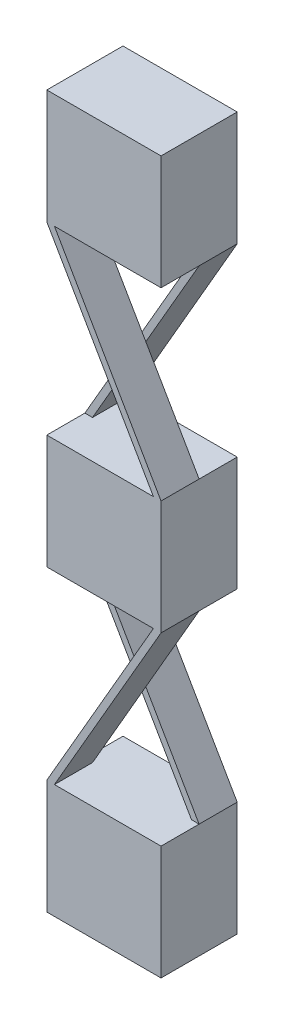
ISO-10303-21;
HEADER;
FILE_DESCRIPTION(('STEP AP214'),'2;1');
FILE_NAME('part.step','',(''),(''),'','','');
FILE_SCHEMA(('AUTOMOTIVE_DESIGN { 1 0 10303 214 1 1 1 1 }'));
ENDSEC;
DATA;
#1=APPLICATION_CONTEXT('core data for automotive mechanical design processes');
#2=APPLICATION_PROTOCOL_DEFINITION('international standard','automotive_design',2000,#1);
#3=PRODUCT_CONTEXT('',#1,'mechanical');
#4=PRODUCT('Part','Part','',(#3));
#5=PRODUCT_RELATED_PRODUCT_CATEGORY('part','',(#4));
#6=PRODUCT_DEFINITION_FORMATION('','',#4);
#7=PRODUCT_DEFINITION_CONTEXT('part definition',#1,'design');
#8=PRODUCT_DEFINITION('design','',#6,#7);
#9=PRODUCT_DEFINITION_SHAPE('','',#8);
#10=(LENGTH_UNIT() NAMED_UNIT(*) SI_UNIT(.MILLI.,.METRE.));
#11=(NAMED_UNIT(*) PLANE_ANGLE_UNIT() SI_UNIT($,.RADIAN.));
#12=(NAMED_UNIT(*) SI_UNIT($,.STERADIAN.) SOLID_ANGLE_UNIT());
#13=UNCERTAINTY_MEASURE_WITH_UNIT(LENGTH_MEASURE(1.E-05),#10,'distance_accuracy_value','');
#14=(GEOMETRIC_REPRESENTATION_CONTEXT(3) GLOBAL_UNCERTAINTY_ASSIGNED_CONTEXT((#13)) GLOBAL_UNIT_ASSIGNED_CONTEXT((#10,
#11,#12)) REPRESENTATION_CONTEXT('',''));
#15=CARTESIAN_POINT('',(0.,0.,0.));
#16=DIRECTION('',(0.,0.,1.));
#17=DIRECTION('',(1.,0.,0.));
#18=AXIS2_PLACEMENT_3D('',#15,#16,#17);
#19=CARTESIAN_POINT('',(0.,0.,0.));
#20=DIRECTION('',(0.,0.,1.));
#21=DIRECTION('',(1.,0.,0.));
#22=AXIS2_PLACEMENT_3D('',#19,#20,#21);
#23=PLANE('',#22);
#24=DIRECTION('',(0.500000000000005,-0.866025403784436,0.));
#25=VECTOR('',#24,1.);
#26=CARTESIAN_POINT('',(17.3701905283832,10.0286841774373,0.));
#27=LINE('',#26,#25);
#28=CARTESIAN_POINT('',(-6.50000000000005,51.3730669589459,0.));
#29=VERTEX_POINT('',#28);
#30=CARTESIAN_POINT('',(0.,40.1147367097484,0.));
#31=VERTEX_POINT('',#30);
#32=EDGE_CURVE('E283',#29,#31,#27,.T.);
#33=ORIENTED_EDGE('',*,*,#32,.T.);
#34=DIRECTION('',(-0.500000000000002,-0.866025403784437,0.));
#35=VECTOR('',#34,1.);
#36=CARTESIAN_POINT('',(-17.3701905283832,10.0286841774372,0.));
#37=LINE('',#36,#35);
#38=CARTESIAN_POINT('',(-0.500000000000046,39.248711305964,0.));
#39=VERTEX_POINT('',#38);
#40=EDGE_CURVE('E12',#31,#39,#37,.T.);
#41=ORIENTED_EDGE('',*,*,#40,.T.);
#42=DIRECTION('',(-0.500000000000007,0.866025403784435,0.));
#43=VECTOR('',#42,1.);
#44=CARTESIAN_POINT('',(16.6201905283833,9.59567147554515,0.));
#45=LINE('',#44,#43);
#46=CARTESIAN_POINT('',(-7.50000000000008,51.3730669589459,0.));
#47=VERTEX_POINT('',#46);
#48=EDGE_CURVE('E360',#39,#47,#45,.T.);
#49=ORIENTED_EDGE('',*,*,#48,.T.);
#50=DIRECTION('',(1.,0.,0.));
#51=VECTOR('',#50,1.);
#52=CARTESIAN_POINT('',(-1.30706495753698E-13,51.373066958946,0.));
#53=LINE('',#52,#51);
#54=EDGE_CURVE('E560',#47,#29,#53,.T.);
#55=ORIENTED_EDGE('',*,*,#54,.T.);
#56=EDGE_LOOP('',(#33,#41,#49,#55));
#57=FACE_BOUND('',#56,.T.);
#58=ADVANCED_FACE('F54',(#57),#23,.F.);
#59=CARTESIAN_POINT('',(0.,27.124355652982,5.));
#60=DIRECTION('',(0.,-1.,0.));
#61=DIRECTION('',(1.,0.,0.));
#62=AXIS2_PLACEMENT_3D('',#59,#60,#61);
#63=PLANE('',#62);
#64=DIRECTION('',(-1.,0.,0.));
#65=VECTOR('',#64,1.);
#66=CARTESIAN_POINT('',(0.,27.124355652982,-5.));
#67=LINE('',#66,#65);
#68=CARTESIAN_POINT('',(7.49999999999999,27.124355652982,-5.));
#69=VERTEX_POINT('',#68);
#70=CARTESIAN_POINT('',(-6.50000000000003,27.124355652982,-5.));
#71=VERTEX_POINT('',#70);
#72=EDGE_CURVE('E541',#69,#71,#67,.T.);
#73=ORIENTED_EDGE('',*,*,#72,.T.);
#74=DIRECTION('',(0.,0.,-1.));
#75=VECTOR('',#74,1.);
#76=CARTESIAN_POINT('',(-6.50000000000003,27.124355652982,0.));
#77=LINE('',#76,#75);
#78=CARTESIAN_POINT('',(-6.50000000000003,27.124355652982,0.));
#79=VERTEX_POINT('',#78);
#80=EDGE_CURVE('E577',#79,#71,#77,.T.);
#81=ORIENTED_EDGE('',*,*,#80,.F.);
#82=DIRECTION('',(-1.,0.,0.));
#83=VECTOR('',#82,1.);
#84=CARTESIAN_POINT('',(0.,27.124355652982,0.));
#85=LINE('',#84,#83);
#86=CARTESIAN_POINT('',(-7.50000000000002,27.124355652982,0.));
#87=VERTEX_POINT('',#86);
#88=EDGE_CURVE('E595',#79,#87,#85,.T.);
#89=ORIENTED_EDGE('',*,*,#88,.T.);
#90=DIRECTION('',(0.,0.,-1.));
#91=VECTOR('',#90,1.);
#92=CARTESIAN_POINT('',(-7.50000000000001,27.124355652982,5.));
#93=LINE('',#92,#91);
#94=CARTESIAN_POINT('',(-7.50000000000001,27.124355652982,5.));
#95=VERTEX_POINT('',#94);
#96=EDGE_CURVE('E367',#95,#87,#93,.T.);
#97=ORIENTED_EDGE('',*,*,#96,.F.);
#98=DIRECTION('',(-1.,0.,0.));
#99=VECTOR('',#98,1.);
#100=CARTESIAN_POINT('',(0.,27.124355652982,5.));
#101=LINE('',#100,#99);
#102=CARTESIAN_POINT('',(6.5,27.124355652982,5.));
#103=VERTEX_POINT('',#102);
#104=EDGE_CURVE('E551',#103,#95,#101,.T.);
#105=ORIENTED_EDGE('',*,*,#104,.F.);
#106=DIRECTION('',(0.,0.,1.));
#107=VECTOR('',#106,1.);
#108=CARTESIAN_POINT('',(6.5,27.124355652982,0.));
#109=LINE('',#108,#107);
#110=CARTESIAN_POINT('',(6.5,27.124355652982,0.));
#111=VERTEX_POINT('',#110);
#112=EDGE_CURVE('E271',#111,#103,#109,.T.);
#113=ORIENTED_EDGE('',*,*,#112,.F.);
#114=DIRECTION('',(1.,0.,0.));
#115=VECTOR('',#114,1.);
#116=CARTESIAN_POINT('',(0.,27.124355652982,0.));
#117=LINE('',#116,#115);
#118=CARTESIAN_POINT('',(7.49999999999999,27.124355652982,0.));
#119=VERTEX_POINT('',#118);
#120=EDGE_CURVE('E355',#111,#119,#117,.T.);
#121=ORIENTED_EDGE('',*,*,#120,.T.);
#122=DIRECTION('',(0.,0.,-1.));
#123=VECTOR('',#122,1.);
#124=CARTESIAN_POINT('',(7.49999999999999,27.124355652982,5.));
#125=LINE('',#124,#123);
#126=EDGE_CURVE('E352',#119,#69,#125,.T.);
#127=ORIENTED_EDGE('',*,*,#126,.T.);
#128=EDGE_LOOP('',(#73,#81,#89,#97,#105,#113,#121,#127));
#129=FACE_BOUND('',#128,.T.);
#130=ADVANCED_FACE('F357',(#129),#63,.F.);
#131=CARTESIAN_POINT('',(0.,-12.124355652982,5.));
#132=DIRECTION('',(0.,-1.,0.));
#133=DIRECTION('',(1.,0.,0.));
#134=AXIS2_PLACEMENT_3D('',#131,#132,#133);
#135=PLANE('',#134);
#136=DIRECTION('',(0.,0.,-1.));
#137=VECTOR('',#136,1.);
#138=CARTESIAN_POINT('',(6.49999999999997,-12.124355652982,0.));
#139=LINE('',#138,#137);
#140=CARTESIAN_POINT('',(6.49999999999997,-12.124355652982,0.));
#141=VERTEX_POINT('',#140);
#142=CARTESIAN_POINT('',(6.49999999999997,-12.124355652982,-5.));
#143=VERTEX_POINT('',#142);
#144=EDGE_CURVE('E407',#141,#143,#139,.T.);
#145=ORIENTED_EDGE('',*,*,#144,.T.);
#146=DIRECTION('',(-1.,0.,0.));
#147=VECTOR('',#146,1.);
#148=CARTESIAN_POINT('',(0.,-12.124355652982,-5.));
#149=LINE('',#148,#147);
#150=CARTESIAN_POINT('',(-7.5,-12.124355652982,-5.));
#151=VERTEX_POINT('',#150);
#152=EDGE_CURVE('E305',#143,#151,#149,.T.);
#153=ORIENTED_EDGE('',*,*,#152,.T.);
#154=DIRECTION('',(0.,0.,-1.));
#155=VECTOR('',#154,1.);
#156=CARTESIAN_POINT('',(-7.5,-12.124355652982,5.));
#157=LINE('',#156,#155);
#158=CARTESIAN_POINT('',(-7.5,-12.124355652982,0.));
#159=VERTEX_POINT('',#158);
#160=EDGE_CURVE('E314',#159,#151,#157,.T.);
#161=ORIENTED_EDGE('',*,*,#160,.F.);
#162=DIRECTION('',(1.,0.,0.));
#163=VECTOR('',#162,1.);
#164=CARTESIAN_POINT('',(0.,-12.124355652982,0.));
#165=LINE('',#164,#163);
#166=CARTESIAN_POINT('',(-6.49999999999997,-12.124355652982,0.));
#167=VERTEX_POINT('',#166);
#168=EDGE_CURVE('E422',#159,#167,#165,.T.);
#169=ORIENTED_EDGE('',*,*,#168,.T.);
#170=DIRECTION('',(0.,0.,1.));
#171=VECTOR('',#170,1.);
#172=CARTESIAN_POINT('',(-6.49999999999997,-12.124355652982,0.));
#173=LINE('',#172,#171);
#174=CARTESIAN_POINT('',(-6.49999999999997,-12.124355652982,5.));
#175=VERTEX_POINT('',#174);
#176=EDGE_CURVE('E443',#167,#175,#173,.T.);
#177=ORIENTED_EDGE('',*,*,#176,.T.);
#178=DIRECTION('',(-1.,0.,0.));
#179=VECTOR('',#178,1.);
#180=CARTESIAN_POINT('',(0.,-12.124355652982,5.));
#181=LINE('',#180,#179);
#182=CARTESIAN_POINT('',(7.49999999999997,-12.124355652982,5.));
#183=VERTEX_POINT('',#182);
#184=EDGE_CURVE('E459',#183,#175,#181,.T.);
#185=ORIENTED_EDGE('',*,*,#184,.F.);
#186=DIRECTION('',(0.,0.,-1.));
#187=VECTOR('',#186,1.);
#188=CARTESIAN_POINT('',(7.49999999999997,-12.124355652982,5.));
#189=LINE('',#188,#187);
#190=CARTESIAN_POINT('',(7.49999999999997,-12.124355652982,0.));
#191=VERTEX_POINT('',#190);
#192=EDGE_CURVE('E313',#183,#191,#189,.T.);
#193=ORIENTED_EDGE('',*,*,#192,.T.);
#194=DIRECTION('',(-1.,0.,0.));
#195=VECTOR('',#194,1.);
#196=CARTESIAN_POINT('',(0.,-12.124355652982,0.));
#197=LINE('',#196,#195);
#198=EDGE_CURVE('E378',#191,#141,#197,.T.);
#199=ORIENTED_EDGE('',*,*,#198,.T.);
#200=EDGE_LOOP('',(#145,#153,#161,#169,#177,#185,#193,#199));
#201=FACE_BOUND('',#200,.T.);
#202=ADVANCED_FACE('F492',(#201),#135,.F.);
#203=CARTESIAN_POINT('',(0.,0.,0.));
#204=DIRECTION('',(0.,0.,1.));
#205=DIRECTION('',(1.,0.,0.));
#206=AXIS2_PLACEMENT_3D('',#203,#204,#205);
#207=PLANE('',#206);
#208=DIRECTION('',(-0.500000000000004,0.866025403784436,0.));
#209=VECTOR('',#208,1.);
#210=CARTESIAN_POINT('',(-0.375000000000011,-0.216506350946119,0.));
#211=LINE('',#210,#209);
#212=CARTESIAN_POINT('',(0.,-0.866025403784445,0.));
#213=VERTEX_POINT('',#212);
#214=CARTESIAN_POINT('',(-0.500000000000004,0.,0.));
#215=VERTEX_POINT('',#214);
#216=EDGE_CURVE('E328',#213,#215,#211,.T.);
#217=ORIENTED_EDGE('',*,*,#216,.F.);
#218=DIRECTION('',(0.500000000000003,0.866025403784437,0.));
#219=VECTOR('',#218,1.);
#220=CARTESIAN_POINT('',(0.374999999999998,-0.21650635094611,0.));
#221=LINE('',#220,#219);
#222=EDGE_CURVE('E418',#167,#213,#221,.T.);
#223=ORIENTED_EDGE('',*,*,#222,.F.);
#224=ORIENTED_EDGE('',*,*,#168,.F.);
#225=DIRECTION('',(-0.500000000000005,-0.866025403784436,0.));
#226=VECTOR('',#225,1.);
#227=CARTESIAN_POINT('',(-0.374999999999991,0.216506350946107,0.));
#228=LINE('',#227,#226);
#229=EDGE_CURVE('E427',#215,#159,#228,.T.);
#230=ORIENTED_EDGE('',*,*,#229,.F.);
#231=EDGE_LOOP('',(#217,#223,#224,#230));
#232=FACE_BOUND('',#231,.T.);
#233=ADVANCED_FACE('F716',(#232),#207,.F.);
#234=DIRECTION('',(0.500000000000004,-0.866025403784436,0.));
#235=VECTOR('',#234,1.);
#236=CARTESIAN_POINT('',(0.374999999999982,0.216506350946102,0.));
#237=LINE('',#236,#235);
#238=CARTESIAN_POINT('',(0.,0.866025403784402,0.));
#239=VERTEX_POINT('',#238);
#240=CARTESIAN_POINT('',(0.499999999999989,0.,0.));
#241=VERTEX_POINT('',#240);
#242=EDGE_CURVE('E324',#239,#241,#237,.T.);
#243=ORIENTED_EDGE('',*,*,#242,.F.);
#244=CARTESIAN_POINT('',(6.50000000000002,12.124355652982,0.));
#245=VERTEX_POINT('',#244);
#246=EDGE_CURVE('E428',#245,#239,#228,.T.);
#247=ORIENTED_EDGE('',*,*,#246,.F.);
#248=DIRECTION('',(1.,0.,0.));
#249=VECTOR('',#248,1.);
#250=CARTESIAN_POINT('',(0.,12.124355652982,0.));
#251=LINE('',#250,#249);
#252=CARTESIAN_POINT('',(7.49999999999997,12.124355652982,0.));
#253=VERTEX_POINT('',#252);
#254=EDGE_CURVE('E412',#245,#253,#251,.T.);
#255=ORIENTED_EDGE('',*,*,#254,.T.);
#256=EDGE_CURVE('E416',#241,#253,#221,.T.);
#257=ORIENTED_EDGE('',*,*,#256,.F.);
#258=EDGE_LOOP('',(#243,#247,#255,#257));
#259=FACE_BOUND('',#258,.T.);
#260=ADVANCED_FACE('F505',(#259),#207,.F.);
#261=CARTESIAN_POINT('',(-7.49999999999999,0.,5.));
#262=DIRECTION('',(-1.,0.,0.));
#263=DIRECTION('',(0.,-1.,0.));
#264=AXIS2_PLACEMENT_3D('',#261,#262,#263);
#265=PLANE('',#264);
#266=DIRECTION('',(0.,1.,0.));
#267=VECTOR('',#266,1.);
#268=CARTESIAN_POINT('',(-7.49999999999999,0.,-5.));
#269=LINE('',#268,#267);
#270=CARTESIAN_POINT('',(-7.50000000000001,-27.124355652982,-5.));
#271=VERTEX_POINT('',#270);
#272=EDGE_CURVE('E301',#271,#151,#269,.T.);
#273=ORIENTED_EDGE('',*,*,#272,.F.);
#274=DIRECTION('',(0.,0.,-1.));
#275=VECTOR('',#274,1.);
#276=CARTESIAN_POINT('',(-7.50000000000001,-27.124355652982,5.));
#277=LINE('',#276,#275);
#278=CARTESIAN_POINT('',(-7.50000000000001,-27.124355652982,5.));
#279=VERTEX_POINT('',#278);
#280=EDGE_CURVE('E321',#279,#271,#277,.T.);
#281=ORIENTED_EDGE('',*,*,#280,.F.);
#282=DIRECTION('',(0.,1.,0.));
#283=VECTOR('',#282,1.);
#284=CARTESIAN_POINT('',(-7.49999999999999,0.,5.));
#285=LINE('',#284,#283);
#286=CARTESIAN_POINT('',(-7.5,-12.124355652982,5.));
#287=VERTEX_POINT('',#286);
#288=EDGE_CURVE('E308',#279,#287,#285,.T.);
#289=ORIENTED_EDGE('',*,*,#288,.T.);
#290=EDGE_CURVE('E309',#287,#159,#157,.T.);
#291=ORIENTED_EDGE('',*,*,#290,.T.);
#292=ORIENTED_EDGE('',*,*,#160,.T.);
#293=EDGE_LOOP('',(#273,#281,#289,#291,#292));
#294=FACE_BOUND('',#293,.T.);
#295=ADVANCED_FACE('F56',(#294),#265,.T.);
#296=CARTESIAN_POINT('',(0.,-27.124355652982,5.));
#297=DIRECTION('',(0.,-1.,0.));
#298=DIRECTION('',(1.,0.,0.));
#299=AXIS2_PLACEMENT_3D('',#296,#297,#298);
#300=PLANE('',#299);
#301=DIRECTION('',(-1.,0.,0.));
#302=VECTOR('',#301,1.);
#303=CARTESIAN_POINT('',(0.,-27.124355652982,-5.));
#304=LINE('',#303,#302);
#305=CARTESIAN_POINT('',(7.49999999999999,-27.124355652982,-5.));
#306=VERTEX_POINT('',#305);
#307=EDGE_CURVE('E294',#306,#271,#304,.T.);
#308=ORIENTED_EDGE('',*,*,#307,.F.);
#309=DIRECTION('',(0.,0.,-1.));
#310=VECTOR('',#309,1.);
#311=CARTESIAN_POINT('',(7.49999999999999,-27.124355652982,5.));
#312=LINE('',#311,#310);
#313=CARTESIAN_POINT('',(7.49999999999999,-27.124355652982,5.));
#314=VERTEX_POINT('',#313);
#315=EDGE_CURVE('E318',#314,#306,#312,.T.);
#316=ORIENTED_EDGE('',*,*,#315,.F.);
#317=DIRECTION('',(-1.,0.,0.));
#318=VECTOR('',#317,1.);
#319=CARTESIAN_POINT('',(0.,-27.124355652982,5.));
#320=LINE('',#319,#318);
#321=EDGE_CURVE('E452',#314,#279,#320,.T.);
#322=ORIENTED_EDGE('',*,*,#321,.T.);
#323=ORIENTED_EDGE('',*,*,#280,.T.);
#324=EDGE_LOOP('',(#308,#316,#322,#323));
#325=FACE_BOUND('',#324,.T.);
#326=ADVANCED_FACE('F672',(#325),#300,.T.);
#327=CARTESIAN_POINT('',(7.49999999999996,0.,5.));
#328=DIRECTION('',(-1.,0.,0.));
#329=DIRECTION('',(0.,-1.,0.));
#330=AXIS2_PLACEMENT_3D('',#327,#328,#329);
#331=PLANE('',#330);
#332=DIRECTION('',(0.,1.,0.));
#333=VECTOR('',#332,1.);
#334=CARTESIAN_POINT('',(7.49999999999996,0.,-5.));
#335=LINE('',#334,#333);
#336=CARTESIAN_POINT('',(7.49999999999997,-12.124355652982,-5.));
#337=VERTEX_POINT('',#336);
#338=EDGE_CURVE('E300',#306,#337,#335,.T.);
#339=ORIENTED_EDGE('',*,*,#338,.T.);
#340=DIRECTION('',(0.,0.,-1.));
#341=VECTOR('',#340,1.);
#342=CARTESIAN_POINT('',(7.49999999999997,-12.124355652982,0.));
#343=LINE('',#342,#341);
#344=EDGE_CURVE('E403',#191,#337,#343,.T.);
#345=ORIENTED_EDGE('',*,*,#344,.F.);
#346=ORIENTED_EDGE('',*,*,#192,.F.);
#347=DIRECTION('',(0.,1.,0.));
#348=VECTOR('',#347,1.);
#349=CARTESIAN_POINT('',(7.49999999999996,0.,5.));
#350=LINE('',#349,#348);
#351=EDGE_CURVE('E457',#314,#183,#350,.T.);
#352=ORIENTED_EDGE('',*,*,#351,.F.);
#353=ORIENTED_EDGE('',*,*,#315,.T.);
#354=EDGE_LOOP('',(#339,#345,#346,#352,#353));
#355=FACE_BOUND('',#354,.T.);
#356=ADVANCED_FACE('F673',(#355),#331,.F.);
#357=CARTESIAN_POINT('',(0.,0.,5.));
#358=DIRECTION('',(0.,0.,1.));
#359=DIRECTION('',(1.,0.,0.));
#360=AXIS2_PLACEMENT_3D('',#357,#358,#359);
#361=PLANE('',#360);
#362=ORIENTED_EDGE('',*,*,#288,.F.);
#363=ORIENTED_EDGE('',*,*,#321,.F.);
#364=ORIENTED_EDGE('',*,*,#351,.T.);
#365=ORIENTED_EDGE('',*,*,#184,.T.);
#366=DIRECTION('',(0.500000000000003,0.866025403784437,0.));
#367=VECTOR('',#366,1.);
#368=CARTESIAN_POINT('',(0.374999999999998,-0.21650635094611,5.));
#369=LINE('',#368,#367);
#370=CARTESIAN_POINT('',(7.49999999999997,12.124355652982,5.));
#371=VERTEX_POINT('',#370);
#372=EDGE_CURVE('E411',#175,#371,#369,.T.);
#373=ORIENTED_EDGE('',*,*,#372,.T.);
#374=DIRECTION('',(0.,-1.,0.));
#375=VECTOR('',#374,1.);
#376=CARTESIAN_POINT('',(7.49999999999996,0.,5.));
#377=LINE('',#376,#375);
#378=CARTESIAN_POINT('',(7.49999999999995,27.124355652982,5.));
#379=VERTEX_POINT('',#378);
#380=EDGE_CURVE('E538',#379,#371,#377,.T.);
#381=ORIENTED_EDGE('',*,*,#380,.F.);
#382=DIRECTION('',(0.500000000000005,-0.866025403784436,0.));
#383=VECTOR('',#382,1.);
#384=CARTESIAN_POINT('',(17.3701905283832,10.0286841774373,5.));
#385=LINE('',#384,#383);
#386=CARTESIAN_POINT('',(-6.50000000000005,51.3730669589459,5.));
#387=VERTEX_POINT('',#386);
#388=EDGE_CURVE('E277',#387,#379,#385,.T.);
#389=ORIENTED_EDGE('',*,*,#388,.F.);
#390=DIRECTION('',(-1.,0.,0.));
#391=VECTOR('',#390,1.);
#392=CARTESIAN_POINT('',(0.,51.373066958946,5.));
#393=LINE('',#392,#391);
#394=CARTESIAN_POINT('',(7.4999999999999,51.373066958946,5.));
#395=VERTEX_POINT('',#394);
#396=EDGE_CURVE('E258',#395,#387,#393,.T.);
#397=ORIENTED_EDGE('',*,*,#396,.F.);
#398=DIRECTION('',(0.,-1.,0.));
#399=VECTOR('',#398,1.);
#400=CARTESIAN_POINT('',(7.49999999999991,39.248711305964,5.));
#401=LINE('',#400,#399);
#402=CARTESIAN_POINT('',(7.49999999999988,66.373066958946,5.));
#403=VERTEX_POINT('',#402);
#404=EDGE_CURVE('E634',#403,#395,#401,.T.);
#405=ORIENTED_EDGE('',*,*,#404,.F.);
#406=DIRECTION('',(-1.,0.,0.));
#407=VECTOR('',#406,1.);
#408=CARTESIAN_POINT('',(-1.76272197126395E-13,66.3730669589459,5.));
#409=LINE('',#408,#407);
#410=CARTESIAN_POINT('',(-7.50000000000012,66.3730669589459,5.));
#411=VERTEX_POINT('',#410);
#412=EDGE_CURVE('E253',#403,#411,#409,.T.);
#413=ORIENTED_EDGE('',*,*,#412,.T.);
#414=DIRECTION('',(0.,-1.,0.));
#415=VECTOR('',#414,1.);
#416=CARTESIAN_POINT('',(-7.50000000000004,39.2487113059639,5.));
#417=LINE('',#416,#415);
#418=CARTESIAN_POINT('',(-7.50000000000008,51.3730669589459,5.));
#419=VERTEX_POINT('',#418);
#420=EDGE_CURVE('E244',#411,#419,#417,.T.);
#421=ORIENTED_EDGE('',*,*,#420,.T.);
#422=DIRECTION('',(-0.500000000000007,0.866025403784435,0.));
#423=VECTOR('',#422,1.);
#424=CARTESIAN_POINT('',(16.6201905283833,9.59567147554515,5.));
#425=LINE('',#424,#423);
#426=EDGE_CURVE('E249',#103,#419,#425,.T.);
#427=ORIENTED_EDGE('',*,*,#426,.F.);
#428=ORIENTED_EDGE('',*,*,#104,.T.);
#429=DIRECTION('',(0.,-1.,0.));
#430=VECTOR('',#429,1.);
#431=CARTESIAN_POINT('',(-7.50000000000001,0.,5.));
#432=LINE('',#431,#430);
#433=CARTESIAN_POINT('',(-7.50000000000001,12.124355652982,5.));
#434=VERTEX_POINT('',#433);
#435=EDGE_CURVE('E548',#95,#434,#432,.T.);
#436=ORIENTED_EDGE('',*,*,#435,.T.);
#437=DIRECTION('',(-1.,0.,0.));
#438=VECTOR('',#437,1.);
#439=CARTESIAN_POINT('',(0.,12.124355652982,5.));
#440=LINE('',#439,#438);
#441=CARTESIAN_POINT('',(6.50000000000002,12.124355652982,5.));
#442=VERTEX_POINT('',#441);
#443=EDGE_CURVE('E527',#442,#434,#440,.T.);
#444=ORIENTED_EDGE('',*,*,#443,.F.);
#445=DIRECTION('',(-0.500000000000005,-0.866025403784436,0.));
#446=VECTOR('',#445,1.);
#447=CARTESIAN_POINT('',(-0.374999999999991,0.216506350946107,5.));
#448=LINE('',#447,#446);
#449=EDGE_CURVE('E417',#442,#287,#448,.T.);
#450=ORIENTED_EDGE('',*,*,#449,.T.);
#451=EDGE_LOOP('',(#362,#363,#364,#365,#373,#381,#389,#397,#405,#413,#421,#427,#428,#436,#444,#450));
#452=FACE_BOUND('',#451,.T.);
#453=ADVANCED_FACE('F247',(#452),#361,.T.);
#454=CARTESIAN_POINT('',(0.,0.,-5.));
#455=DIRECTION('',(0.,0.,1.));
#456=DIRECTION('',(1.,0.,0.));
#457=AXIS2_PLACEMENT_3D('',#454,#455,#456);
#458=PLANE('',#457);
#459=ORIENTED_EDGE('',*,*,#272,.T.);
#460=ORIENTED_EDGE('',*,*,#152,.F.);
#461=DIRECTION('',(0.500000000000004,-0.866025403784436,0.));
#462=VECTOR('',#461,1.);
#463=CARTESIAN_POINT('',(-0.375000000000011,-0.216506350946119,-5.));
#464=LINE('',#463,#462);
#465=CARTESIAN_POINT('',(-7.50000000000001,12.124355652982,-5.));
#466=VERTEX_POINT('',#465);
#467=EDGE_CURVE('E351',#466,#143,#464,.T.);
#468=ORIENTED_EDGE('',*,*,#467,.F.);
#469=DIRECTION('',(0.,-1.,0.));
#470=VECTOR('',#469,1.);
#471=CARTESIAN_POINT('',(-7.50000000000001,0.,-5.));
#472=LINE('',#471,#470);
#473=CARTESIAN_POINT('',(-7.50000000000001,27.124355652982,-5.));
#474=VERTEX_POINT('',#473);
#475=EDGE_CURVE('E523',#474,#466,#472,.T.);
#476=ORIENTED_EDGE('',*,*,#475,.F.);
#477=DIRECTION('',(0.500000000000002,0.866025403784438,0.));
#478=VECTOR('',#477,1.);
#479=CARTESIAN_POINT('',(-17.3701905283832,10.0286841774372,-5.));
#480=LINE('',#479,#478);
#481=CARTESIAN_POINT('',(6.4999999999999,51.373066958946,-5.));
#482=VERTEX_POINT('',#481);
#483=EDGE_CURVE('E588',#474,#482,#480,.T.);
#484=ORIENTED_EDGE('',*,*,#483,.T.);
#485=DIRECTION('',(-1.,0.,0.));
#486=VECTOR('',#485,1.);
#487=CARTESIAN_POINT('',(0.,51.373066958946,-5.));
#488=LINE('',#487,#486);
#489=CARTESIAN_POINT('',(-7.50000000000008,51.3730669589459,-5.));
#490=VERTEX_POINT('',#489);
#491=EDGE_CURVE('E625',#482,#490,#488,.T.);
#492=ORIENTED_EDGE('',*,*,#491,.T.);
#493=DIRECTION('',(0.,-1.,0.));
#494=VECTOR('',#493,1.);
#495=CARTESIAN_POINT('',(-7.50000000000004,39.2487113059639,-5.));
#496=LINE('',#495,#494);
#497=CARTESIAN_POINT('',(-7.50000000000012,66.3730669589459,-5.));
#498=VERTEX_POINT('',#497);
#499=EDGE_CURVE('E629',#498,#490,#496,.T.);
#500=ORIENTED_EDGE('',*,*,#499,.F.);
#501=DIRECTION('',(-1.,0.,0.));
#502=VECTOR('',#501,1.);
#503=CARTESIAN_POINT('',(-1.76272197126395E-13,66.3730669589459,-5.));
#504=LINE('',#503,#502);
#505=CARTESIAN_POINT('',(7.49999999999988,66.373066958946,-5.));
#506=VERTEX_POINT('',#505);
#507=EDGE_CURVE('E259',#506,#498,#504,.T.);
#508=ORIENTED_EDGE('',*,*,#507,.F.);
#509=DIRECTION('',(0.,-1.,0.));
#510=VECTOR('',#509,1.);
#511=CARTESIAN_POINT('',(7.49999999999991,39.248711305964,-5.));
#512=LINE('',#511,#510);
#513=CARTESIAN_POINT('',(7.4999999999999,51.373066958946,-5.));
#514=VERTEX_POINT('',#513);
#515=EDGE_CURVE('E621',#506,#514,#512,.T.);
#516=ORIENTED_EDGE('',*,*,#515,.T.);
#517=DIRECTION('',(-0.500000000000002,-0.866025403784437,0.));
#518=VECTOR('',#517,1.);
#519=CARTESIAN_POINT('',(-16.6201905283833,9.595671475545,-5.));
#520=LINE('',#519,#518);
#521=EDGE_CURVE('E583',#514,#71,#520,.T.);
#522=ORIENTED_EDGE('',*,*,#521,.T.);
#523=ORIENTED_EDGE('',*,*,#72,.F.);
#524=DIRECTION('',(0.,-1.,0.));
#525=VECTOR('',#524,1.);
#526=CARTESIAN_POINT('',(7.49999999999996,0.,-5.));
#527=LINE('',#526,#525);
#528=CARTESIAN_POINT('',(7.49999999999997,12.124355652982,-5.));
#529=VERTEX_POINT('',#528);
#530=EDGE_CURVE('E365',#69,#529,#527,.T.);
#531=ORIENTED_EDGE('',*,*,#530,.T.);
#532=DIRECTION('',(-1.,0.,0.));
#533=VECTOR('',#532,1.);
#534=CARTESIAN_POINT('',(0.,12.124355652982,-5.));
#535=LINE('',#534,#533);
#536=CARTESIAN_POINT('',(-6.50000000000001,12.124355652982,-5.));
#537=VERTEX_POINT('',#536);
#538=EDGE_CURVE('E534',#529,#537,#535,.T.);
#539=ORIENTED_EDGE('',*,*,#538,.T.);
#540=DIRECTION('',(-0.500000000000004,0.866025403784436,0.));
#541=VECTOR('',#540,1.);
#542=CARTESIAN_POINT('',(0.374999999999982,0.216506350946102,-5.));
#543=LINE('',#542,#541);
#544=EDGE_CURVE('E394',#337,#537,#543,.T.);
#545=ORIENTED_EDGE('',*,*,#544,.F.);
#546=ORIENTED_EDGE('',*,*,#338,.F.);
#547=ORIENTED_EDGE('',*,*,#307,.T.);
#548=EDGE_LOOP('',(#459,#460,#468,#476,#484,#492,#500,#508,#516,#522,#523,#531,#539,#545,#546,#547));
#549=FACE_BOUND('',#548,.T.);
#550=ADVANCED_FACE('F471',(#549),#458,.F.);
#551=CARTESIAN_POINT('',(0.374999999999998,-0.21650635094611,0.));
#552=DIRECTION('',(0.866025403784437,-0.500000000000003,0.));
#553=DIRECTION('',(0.500000000000003,0.866025403784437,0.));
#554=AXIS2_PLACEMENT_3D('',#551,#552,#553);
#555=PLANE('',#554);
#556=ORIENTED_EDGE('',*,*,#372,.F.);
#557=ORIENTED_EDGE('',*,*,#176,.F.);
#558=ORIENTED_EDGE('',*,*,#222,.T.);
#559=EDGE_CURVE('E423',#213,#241,#221,.T.);
#560=ORIENTED_EDGE('',*,*,#559,.T.);
#561=ORIENTED_EDGE('',*,*,#256,.T.);
#562=DIRECTION('',(0.,0.,1.));
#563=VECTOR('',#562,1.);
#564=CARTESIAN_POINT('',(7.49999999999997,12.124355652982,0.));
#565=LINE('',#564,#563);
#566=EDGE_CURVE('E447',#253,#371,#565,.T.);
#567=ORIENTED_EDGE('',*,*,#566,.T.);
#568=EDGE_LOOP('',(#556,#557,#558,#560,#561,#567));
#569=FACE_BOUND('',#568,.T.);
#570=ADVANCED_FACE('F645',(#569),#555,.T.);
#571=CARTESIAN_POINT('',(-0.374999999999991,0.216506350946107,0.));
#572=DIRECTION('',(-0.866025403784436,0.500000000000005,0.));
#573=DIRECTION('',(-0.500000000000005,-0.866025403784436,0.));
#574=AXIS2_PLACEMENT_3D('',#571,#572,#573);
#575=PLANE('',#574);
#576=ORIENTED_EDGE('',*,*,#449,.F.);
#577=DIRECTION('',(0.,0.,1.));
#578=VECTOR('',#577,1.);
#579=CARTESIAN_POINT('',(6.50000000000002,12.124355652982,0.));
#580=LINE('',#579,#578);
#581=EDGE_CURVE('E432',#245,#442,#580,.T.);
#582=ORIENTED_EDGE('',*,*,#581,.F.);
#583=ORIENTED_EDGE('',*,*,#246,.T.);
#584=EDGE_CURVE('E433',#239,#215,#228,.T.);
#585=ORIENTED_EDGE('',*,*,#584,.T.);
#586=ORIENTED_EDGE('',*,*,#229,.T.);
#587=ORIENTED_EDGE('',*,*,#290,.F.);
#588=EDGE_LOOP('',(#576,#582,#583,#585,#586,#587));
#589=FACE_BOUND('',#588,.T.);
#590=ADVANCED_FACE('F509',(#589),#575,.T.);
#591=CARTESIAN_POINT('',(0.,0.,0.));
#592=DIRECTION('',(0.,0.,-1.));
#593=DIRECTION('',(-1.,0.,0.));
#594=AXIS2_PLACEMENT_3D('',#591,#592,#593);
#595=PLANE('',#594);
#596=ORIENTED_EDGE('',*,*,#559,.F.);
#597=DIRECTION('',(0.500000000000004,-0.866025403784436,0.));
#598=VECTOR('',#597,1.);
#599=CARTESIAN_POINT('',(-0.375000000000011,-0.216506350946119,0.));
#600=LINE('',#599,#598);
#601=EDGE_CURVE('E379',#213,#141,#600,.T.);
#602=ORIENTED_EDGE('',*,*,#601,.T.);
#603=ORIENTED_EDGE('',*,*,#198,.F.);
#604=DIRECTION('',(-0.500000000000004,0.866025403784436,0.));
#605=VECTOR('',#604,1.);
#606=CARTESIAN_POINT('',(0.374999999999982,0.216506350946102,0.));
#607=LINE('',#606,#605);
#608=EDGE_CURVE('E383',#191,#241,#607,.T.);
#609=ORIENTED_EDGE('',*,*,#608,.T.);
#610=EDGE_LOOP('',(#596,#602,#603,#609));
#611=FACE_BOUND('',#610,.T.);
#612=ADVANCED_FACE('F489',(#611),#595,.F.);
#613=CARTESIAN_POINT('',(-0.375000000000011,-0.216506350946119,0.));
#614=DIRECTION('',(0.866025403784436,0.500000000000004,0.));
#615=DIRECTION('',(-0.500000000000004,0.866025403784436,0.));
#616=AXIS2_PLACEMENT_3D('',#613,#614,#615);
#617=PLANE('',#616);
#618=ORIENTED_EDGE('',*,*,#467,.T.);
#619=ORIENTED_EDGE('',*,*,#144,.F.);
#620=ORIENTED_EDGE('',*,*,#601,.F.);
#621=ORIENTED_EDGE('',*,*,#216,.T.);
#622=CARTESIAN_POINT('',(-7.50000000000001,12.124355652982,0.));
#623=VERTEX_POINT('',#622);
#624=EDGE_CURVE('E374',#623,#215,#600,.T.);
#625=ORIENTED_EDGE('',*,*,#624,.F.);
#626=DIRECTION('',(0.,0.,-1.));
#627=VECTOR('',#626,1.);
#628=CARTESIAN_POINT('',(-7.50000000000001,12.124355652982,0.));
#629=LINE('',#628,#627);
#630=EDGE_CURVE('E390',#623,#466,#629,.T.);
#631=ORIENTED_EDGE('',*,*,#630,.T.);
#632=EDGE_LOOP('',(#618,#619,#620,#621,#625,#631));
#633=FACE_BOUND('',#632,.T.);
#634=ADVANCED_FACE('F491',(#633),#617,.F.);
#635=CARTESIAN_POINT('',(0.374999999999982,0.216506350946102,0.));
#636=DIRECTION('',(-0.866025403784436,-0.500000000000004,0.));
#637=DIRECTION('',(0.500000000000004,-0.866025403784436,0.));
#638=AXIS2_PLACEMENT_3D('',#635,#636,#637);
#639=PLANE('',#638);
#640=ORIENTED_EDGE('',*,*,#544,.T.);
#641=DIRECTION('',(0.,0.,-1.));
#642=VECTOR('',#641,1.);
#643=CARTESIAN_POINT('',(-6.50000000000001,12.124355652982,0.));
#644=LINE('',#643,#642);
#645=CARTESIAN_POINT('',(-6.50000000000001,12.124355652982,0.));
#646=VERTEX_POINT('',#645);
#647=EDGE_CURVE('E399',#646,#537,#644,.T.);
#648=ORIENTED_EDGE('',*,*,#647,.F.);
#649=EDGE_CURVE('E382',#239,#646,#607,.T.);
#650=ORIENTED_EDGE('',*,*,#649,.F.);
#651=ORIENTED_EDGE('',*,*,#242,.T.);
#652=ORIENTED_EDGE('',*,*,#608,.F.);
#653=ORIENTED_EDGE('',*,*,#344,.T.);
#654=EDGE_LOOP('',(#640,#648,#650,#651,#652,#653));
#655=FACE_BOUND('',#654,.T.);
#656=ADVANCED_FACE('F498',(#655),#639,.F.);
#657=ORIENTED_EDGE('',*,*,#584,.F.);
#658=ORIENTED_EDGE('',*,*,#649,.T.);
#659=DIRECTION('',(-1.,0.,0.));
#660=VECTOR('',#659,1.);
#661=CARTESIAN_POINT('',(0.,12.124355652982,0.));
#662=LINE('',#661,#660);
#663=EDGE_CURVE('E387',#646,#623,#662,.T.);
#664=ORIENTED_EDGE('',*,*,#663,.T.);
#665=ORIENTED_EDGE('',*,*,#624,.T.);
#666=EDGE_LOOP('',(#657,#658,#664,#665));
#667=FACE_BOUND('',#666,.T.);
#668=ADVANCED_FACE('F511',(#667),#595,.F.);
#669=CARTESIAN_POINT('',(0.,12.124355652982,5.));
#670=DIRECTION('',(0.,-1.,0.));
#671=DIRECTION('',(1.,0.,0.));
#672=AXIS2_PLACEMENT_3D('',#669,#670,#671);
#673=PLANE('',#672);
#674=ORIENTED_EDGE('',*,*,#254,.F.);
#675=ORIENTED_EDGE('',*,*,#581,.T.);
#676=ORIENTED_EDGE('',*,*,#443,.T.);
#677=DIRECTION('',(0.,0.,-1.));
#678=VECTOR('',#677,1.);
#679=CARTESIAN_POINT('',(-7.50000000000001,12.124355652982,5.));
#680=LINE('',#679,#678);
#681=EDGE_CURVE('E370',#434,#623,#680,.T.);
#682=ORIENTED_EDGE('',*,*,#681,.T.);
#683=ORIENTED_EDGE('',*,*,#663,.F.);
#684=ORIENTED_EDGE('',*,*,#647,.T.);
#685=ORIENTED_EDGE('',*,*,#538,.F.);
#686=DIRECTION('',(0.,0.,-1.));
#687=VECTOR('',#686,1.);
#688=CARTESIAN_POINT('',(7.49999999999997,12.124355652982,5.));
#689=LINE('',#688,#687);
#690=EDGE_CURVE('E530',#253,#529,#689,.T.);
#691=ORIENTED_EDGE('',*,*,#690,.F.);
#692=EDGE_LOOP('',(#674,#675,#676,#682,#683,#684,#685,#691));
#693=FACE_BOUND('',#692,.T.);
#694=ADVANCED_FACE('F525',(#693),#673,.T.);
#695=CARTESIAN_POINT('',(7.49999999999996,0.,5.));
#696=DIRECTION('',(1.,0.,0.));
#697=DIRECTION('',(0.,1.,0.));
#698=AXIS2_PLACEMENT_3D('',#695,#696,#697);
#699=PLANE('',#698);
#700=ORIENTED_EDGE('',*,*,#530,.F.);
#701=ORIENTED_EDGE('',*,*,#126,.F.);
#702=EDGE_CURVE('E342',#379,#119,#125,.T.);
#703=ORIENTED_EDGE('',*,*,#702,.F.);
#704=ORIENTED_EDGE('',*,*,#380,.T.);
#705=ORIENTED_EDGE('',*,*,#566,.F.);
#706=ORIENTED_EDGE('',*,*,#690,.T.);
#707=EDGE_LOOP('',(#700,#701,#703,#704,#705,#706));
#708=FACE_BOUND('',#707,.T.);
#709=ADVANCED_FACE('F363',(#708),#699,.T.);
#710=CARTESIAN_POINT('',(-7.50000000000001,0.,5.));
#711=DIRECTION('',(1.,0.,0.));
#712=DIRECTION('',(0.,0.,-1.));
#713=AXIS2_PLACEMENT_3D('',#710,#711,#712);
#714=PLANE('',#713);
#715=ORIENTED_EDGE('',*,*,#475,.T.);
#716=ORIENTED_EDGE('',*,*,#630,.F.);
#717=ORIENTED_EDGE('',*,*,#681,.F.);
#718=ORIENTED_EDGE('',*,*,#435,.F.);
#719=ORIENTED_EDGE('',*,*,#96,.T.);
#720=DIRECTION('',(0.,0.,-1.));
#721=VECTOR('',#720,1.);
#722=CARTESIAN_POINT('',(-7.50000000000002,27.124355652982,0.));
#723=LINE('',#722,#721);
#724=EDGE_CURVE('E574',#87,#474,#723,.T.);
#725=ORIENTED_EDGE('',*,*,#724,.T.);
#726=EDGE_LOOP('',(#715,#716,#717,#718,#719,#725));
#727=FACE_BOUND('',#726,.T.);
#728=ADVANCED_FACE('F519',(#727),#714,.F.);
#729=CARTESIAN_POINT('',(17.3701905283832,10.0286841774373,0.));
#730=DIRECTION('',(-0.866025403784436,-0.500000000000005,0.));
#731=DIRECTION('',(0.500000000000005,-0.866025403784436,0.));
#732=AXIS2_PLACEMENT_3D('',#729,#730,#731);
#733=PLANE('',#732);
#734=ORIENTED_EDGE('',*,*,#388,.T.);
#735=ORIENTED_EDGE('',*,*,#702,.T.);
#736=CARTESIAN_POINT('',(0.499999999999941,39.248711305964,0.));
#737=VERTEX_POINT('',#736);
#738=EDGE_CURVE('E78',#737,#119,#27,.T.);
#739=ORIENTED_EDGE('',*,*,#738,.F.);
#740=EDGE_CURVE('E281',#31,#737,#27,.T.);
#741=ORIENTED_EDGE('',*,*,#740,.F.);
#742=ORIENTED_EDGE('',*,*,#32,.F.);
#743=DIRECTION('',(0.,0.,1.));
#744=VECTOR('',#743,1.);
#745=CARTESIAN_POINT('',(-6.50000000000005,51.3730669589459,0.));
#746=LINE('',#745,#744);
#747=EDGE_CURVE('E272',#29,#387,#746,.T.);
#748=ORIENTED_EDGE('',*,*,#747,.T.);
#749=EDGE_LOOP('',(#734,#735,#739,#741,#742,#748));
#750=FACE_BOUND('',#749,.T.);
#751=ADVANCED_FACE('F338',(#750),#733,.F.);
#752=CARTESIAN_POINT('',(16.6201905283833,9.59567147554515,0.));
#753=DIRECTION('',(0.866025403784434,0.500000000000007,0.));
#754=DIRECTION('',(-0.500000000000007,0.866025403784434,0.));
#755=AXIS2_PLACEMENT_3D('',#752,#753,#754);
#756=PLANE('',#755);
#757=ORIENTED_EDGE('',*,*,#426,.T.);
#758=DIRECTION('',(0.,0.,1.));
#759=VECTOR('',#758,1.);
#760=CARTESIAN_POINT('',(-7.50000000000009,51.3730669589459,0.));
#761=LINE('',#760,#759);
#762=EDGE_CURVE('E263',#47,#419,#761,.T.);
#763=ORIENTED_EDGE('',*,*,#762,.F.);
#764=ORIENTED_EDGE('',*,*,#48,.F.);
#765=CARTESIAN_POINT('',(0.,38.3826859021796,0.));
#766=VERTEX_POINT('',#765);
#767=EDGE_CURVE('E564',#766,#39,#45,.T.);
#768=ORIENTED_EDGE('',*,*,#767,.F.);
#769=EDGE_CURVE('E334',#111,#766,#45,.T.);
#770=ORIENTED_EDGE('',*,*,#769,.F.);
#771=ORIENTED_EDGE('',*,*,#112,.T.);
#772=EDGE_LOOP('',(#757,#763,#764,#768,#770,#771));
#773=FACE_BOUND('',#772,.T.);
#774=ADVANCED_FACE('F274',(#773),#756,.F.);
#775=ORIENTED_EDGE('',*,*,#769,.T.);
#776=DIRECTION('',(0.500000000000002,0.866025403784437,0.));
#777=VECTOR('',#776,1.);
#778=CARTESIAN_POINT('',(-16.6201905283833,9.595671475545,0.));
#779=LINE('',#778,#777);
#780=EDGE_CURVE('E63',#766,#737,#779,.T.);
#781=ORIENTED_EDGE('',*,*,#780,.T.);
#782=ORIENTED_EDGE('',*,*,#738,.T.);
#783=ORIENTED_EDGE('',*,*,#120,.F.);
#784=EDGE_LOOP('',(#775,#781,#782,#783));
#785=FACE_BOUND('',#784,.T.);
#786=ADVANCED_FACE('F333',(#785),#23,.F.);
#787=CARTESIAN_POINT('',(0.,0.,0.));
#788=DIRECTION('',(0.,0.,-1.));
#789=DIRECTION('',(-1.,0.,0.));
#790=AXIS2_PLACEMENT_3D('',#787,#788,#789);
#791=PLANE('',#790);
#792=DIRECTION('',(0.500000000000002,0.866025403784438,0.));
#793=VECTOR('',#792,1.);
#794=CARTESIAN_POINT('',(-17.3701905283832,10.0286841774372,0.));
#795=LINE('',#794,#793);
#796=CARTESIAN_POINT('',(6.4999999999999,51.373066958946,0.));
#797=VERTEX_POINT('',#796);
#798=EDGE_CURVE('E603',#31,#797,#795,.T.);
#799=ORIENTED_EDGE('',*,*,#798,.F.);
#800=ORIENTED_EDGE('',*,*,#740,.T.);
#801=DIRECTION('',(-0.500000000000002,-0.866025403784437,0.));
#802=VECTOR('',#801,1.);
#803=CARTESIAN_POINT('',(-16.6201905283833,9.595671475545,0.));
#804=LINE('',#803,#802);
#805=CARTESIAN_POINT('',(7.4999999999999,51.373066958946,0.));
#806=VERTEX_POINT('',#805);
#807=EDGE_CURVE('E70',#806,#737,#804,.T.);
#808=ORIENTED_EDGE('',*,*,#807,.F.);
#809=DIRECTION('',(-1.,0.,0.));
#810=VECTOR('',#809,1.);
#811=CARTESIAN_POINT('',(-1.30706495753698E-13,51.373066958946,0.));
#812=LINE('',#811,#810);
#813=EDGE_CURVE('E587',#806,#797,#812,.T.);
#814=ORIENTED_EDGE('',*,*,#813,.T.);
#815=EDGE_LOOP('',(#799,#800,#808,#814));
#816=FACE_BOUND('',#815,.T.);
#817=ADVANCED_FACE('F668',(#816),#791,.F.);
#818=EDGE_CURVE('E594',#766,#79,#804,.T.);
#819=ORIENTED_EDGE('',*,*,#818,.F.);
#820=ORIENTED_EDGE('',*,*,#767,.T.);
#821=EDGE_CURVE('E599',#87,#39,#795,.T.);
#822=ORIENTED_EDGE('',*,*,#821,.F.);
#823=ORIENTED_EDGE('',*,*,#88,.F.);
#824=EDGE_LOOP('',(#819,#820,#822,#823));
#825=FACE_BOUND('',#824,.T.);
#826=ADVANCED_FACE('F655',(#825),#791,.F.);
#827=CARTESIAN_POINT('',(-17.3701905283832,10.0286841774372,0.));
#828=DIRECTION('',(-0.866025403784438,0.500000000000002,0.));
#829=DIRECTION('',(-0.500000000000002,-0.866025403784437,0.));
#830=AXIS2_PLACEMENT_3D('',#827,#828,#829);
#831=PLANE('',#830);
#832=ORIENTED_EDGE('',*,*,#483,.F.);
#833=ORIENTED_EDGE('',*,*,#724,.F.);
#834=ORIENTED_EDGE('',*,*,#821,.T.);
#835=ORIENTED_EDGE('',*,*,#40,.F.);
#836=ORIENTED_EDGE('',*,*,#798,.T.);
#837=DIRECTION('',(0.,0.,-1.));
#838=VECTOR('',#837,1.);
#839=CARTESIAN_POINT('',(6.4999999999999,51.373066958946,0.));
#840=LINE('',#839,#838);
#841=EDGE_CURVE('E284',#797,#482,#840,.T.);
#842=ORIENTED_EDGE('',*,*,#841,.T.);
#843=EDGE_LOOP('',(#832,#833,#834,#835,#836,#842));
#844=FACE_BOUND('',#843,.T.);
#845=ADVANCED_FACE('F658',(#844),#831,.T.);
#846=CARTESIAN_POINT('',(-16.6201905283833,9.595671475545,0.));
#847=DIRECTION('',(0.866025403784437,-0.500000000000002,0.));
#848=DIRECTION('',(0.500000000000002,0.866025403784437,0.));
#849=AXIS2_PLACEMENT_3D('',#846,#847,#848);
#850=PLANE('',#849);
#851=ORIENTED_EDGE('',*,*,#521,.F.);
#852=DIRECTION('',(0.,0.,-1.));
#853=VECTOR('',#852,1.);
#854=CARTESIAN_POINT('',(7.4999999999999,51.373066958946,0.));
#855=LINE('',#854,#853);
#856=EDGE_CURVE('E580',#806,#514,#855,.T.);
#857=ORIENTED_EDGE('',*,*,#856,.F.);
#858=ORIENTED_EDGE('',*,*,#807,.T.);
#859=ORIENTED_EDGE('',*,*,#780,.F.);
#860=ORIENTED_EDGE('',*,*,#818,.T.);
#861=ORIENTED_EDGE('',*,*,#80,.T.);
#862=EDGE_LOOP('',(#851,#857,#858,#859,#860,#861));
#863=FACE_BOUND('',#862,.T.);
#864=ADVANCED_FACE('F651',(#863),#850,.T.);
#865=CARTESIAN_POINT('',(0.,51.373066958946,5.));
#866=DIRECTION('',(0.,-1.,0.));
#867=DIRECTION('',(1.,0.,0.));
#868=AXIS2_PLACEMENT_3D('',#865,#866,#867);
#869=PLANE('',#868);
#870=ORIENTED_EDGE('',*,*,#747,.F.);
#871=ORIENTED_EDGE('',*,*,#54,.F.);
#872=DIRECTION('',(0.,0.,-1.));
#873=VECTOR('',#872,1.);
#874=CARTESIAN_POINT('',(-7.50000000000008,51.3730669589459,5.));
#875=LINE('',#874,#873);
#876=EDGE_CURVE('E266',#47,#490,#875,.T.);
#877=ORIENTED_EDGE('',*,*,#876,.T.);
#878=ORIENTED_EDGE('',*,*,#491,.F.);
#879=ORIENTED_EDGE('',*,*,#841,.F.);
#880=ORIENTED_EDGE('',*,*,#813,.F.);
#881=DIRECTION('',(0.,0.,-1.));
#882=VECTOR('',#881,1.);
#883=CARTESIAN_POINT('',(7.4999999999999,51.373066958946,5.));
#884=LINE('',#883,#882);
#885=EDGE_CURVE('E609',#395,#806,#884,.T.);
#886=ORIENTED_EDGE('',*,*,#885,.F.);
#887=ORIENTED_EDGE('',*,*,#396,.T.);
#888=EDGE_LOOP('',(#870,#871,#877,#878,#879,#880,#886,#887));
#889=FACE_BOUND('',#888,.T.);
#890=ADVANCED_FACE('F641',(#889),#869,.T.);
#891=CARTESIAN_POINT('',(-7.50000000000004,39.2487113059639,5.));
#892=DIRECTION('',(1.,0.,0.));
#893=DIRECTION('',(0.,1.,0.));
#894=AXIS2_PLACEMENT_3D('',#891,#892,#893);
#895=PLANE('',#894);
#896=ORIENTED_EDGE('',*,*,#499,.T.);
#897=ORIENTED_EDGE('',*,*,#876,.F.);
#898=ORIENTED_EDGE('',*,*,#762,.T.);
#899=ORIENTED_EDGE('',*,*,#420,.F.);
#900=DIRECTION('',(0.,0.,-1.));
#901=VECTOR('',#900,1.);
#902=CARTESIAN_POINT('',(-7.50000000000012,66.3730669589459,5.));
#903=LINE('',#902,#901);
#904=EDGE_CURVE('E616',#411,#498,#903,.T.);
#905=ORIENTED_EDGE('',*,*,#904,.T.);
#906=EDGE_LOOP('',(#896,#897,#898,#899,#905));
#907=FACE_BOUND('',#906,.T.);
#908=ADVANCED_FACE('F265',(#907),#895,.F.);
#909=CARTESIAN_POINT('',(7.49999999999991,39.248711305964,5.));
#910=DIRECTION('',(1.,0.,0.));
#911=DIRECTION('',(0.,1.,0.));
#912=AXIS2_PLACEMENT_3D('',#909,#910,#911);
#913=PLANE('',#912);
#914=ORIENTED_EDGE('',*,*,#515,.F.);
#915=DIRECTION('',(0.,0.,-1.));
#916=VECTOR('',#915,1.);
#917=CARTESIAN_POINT('',(7.49999999999988,66.373066958946,5.));
#918=LINE('',#917,#916);
#919=EDGE_CURVE('E613',#403,#506,#918,.T.);
#920=ORIENTED_EDGE('',*,*,#919,.F.);
#921=ORIENTED_EDGE('',*,*,#404,.T.);
#922=ORIENTED_EDGE('',*,*,#885,.T.);
#923=ORIENTED_EDGE('',*,*,#856,.T.);
#924=EDGE_LOOP('',(#914,#920,#921,#922,#923));
#925=FACE_BOUND('',#924,.T.);
#926=ADVANCED_FACE('F667',(#925),#913,.T.);
#927=CARTESIAN_POINT('',(-1.76272197126395E-13,66.3730669589459,5.));
#928=DIRECTION('',(0.,-1.,0.));
#929=DIRECTION('',(1.,0.,0.));
#930=AXIS2_PLACEMENT_3D('',#927,#928,#929);
#931=PLANE('',#930);
#932=ORIENTED_EDGE('',*,*,#507,.T.);
#933=ORIENTED_EDGE('',*,*,#904,.F.);
#934=ORIENTED_EDGE('',*,*,#412,.F.);
#935=ORIENTED_EDGE('',*,*,#919,.T.);
#936=EDGE_LOOP('',(#932,#933,#934,#935));
#937=FACE_BOUND('',#936,.T.);
#938=ADVANCED_FACE('F664',(#937),#931,.F.);
#939=CLOSED_SHELL('',(#58,#130,#202,#233,#260,#295,#326,#356,#453,#550,#570,#590,#612,#634,#656,
#668,#694,#709,#728,#751,#774,#786,#817,#826,#845,#864,#890,#908,#926,#938));
#940=MANIFOLD_SOLID_BREP('B2',#939);
#941=ADVANCED_BREP_SHAPE_REPRESENTATION('',(#18,#940),#14);
#942=SHAPE_DEFINITION_REPRESENTATION(#9,#941);
ENDSEC;
END-ISO-10303-21;
